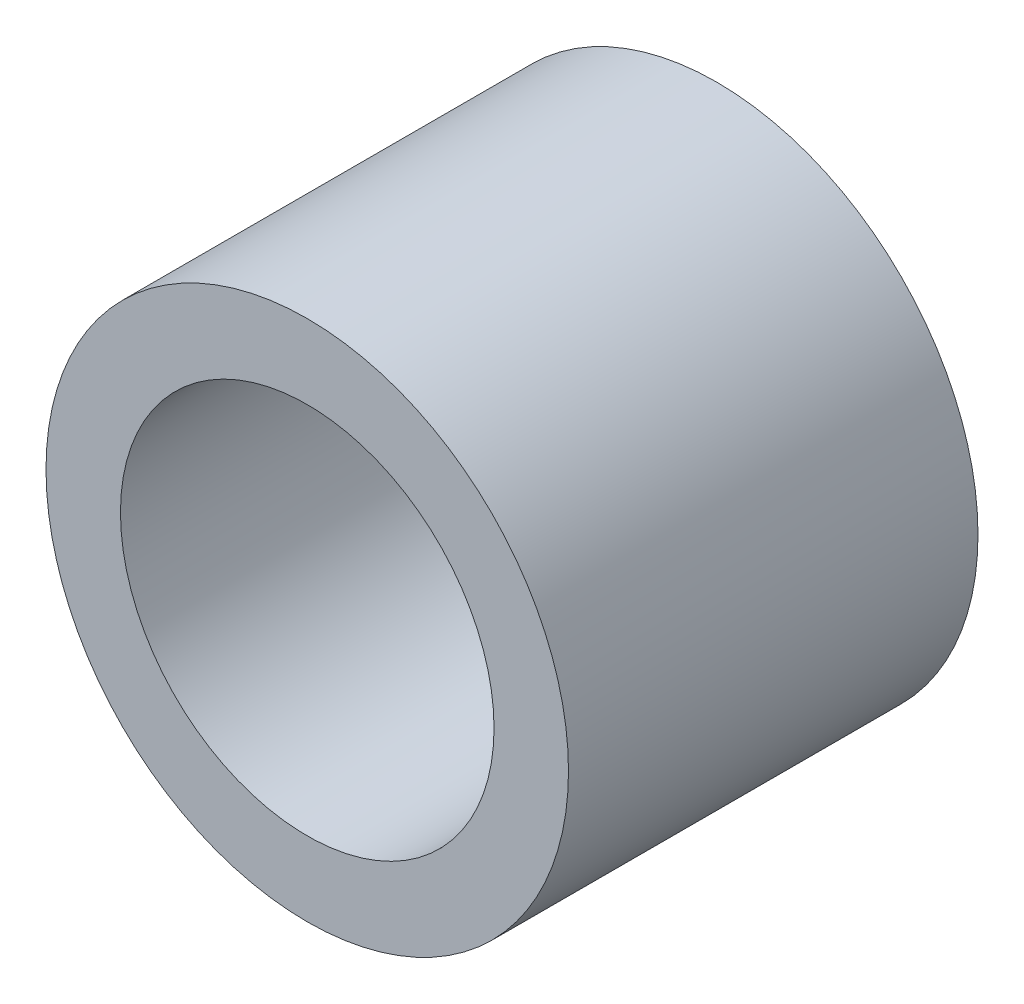
ISO-10303-21;
HEADER;
FILE_DESCRIPTION(('STEP AP214'),'2;1');
FILE_NAME('part.step','',(''),(''),'','','');
FILE_SCHEMA(('AUTOMOTIVE_DESIGN { 1 0 10303 214 1 1 1 1 }'));
ENDSEC;
DATA;
#1=APPLICATION_CONTEXT('core data for automotive mechanical design processes');
#2=APPLICATION_PROTOCOL_DEFINITION('international standard','automotive_design',2000,#1);
#3=PRODUCT_CONTEXT('',#1,'mechanical');
#4=PRODUCT('Part','Part','',(#3));
#5=PRODUCT_RELATED_PRODUCT_CATEGORY('part','',(#4));
#6=PRODUCT_DEFINITION_FORMATION('','',#4);
#7=PRODUCT_DEFINITION_CONTEXT('part definition',#1,'design');
#8=PRODUCT_DEFINITION('design','',#6,#7);
#9=PRODUCT_DEFINITION_SHAPE('','',#8);
#10=(LENGTH_UNIT() NAMED_UNIT(*) SI_UNIT(.MILLI.,.METRE.));
#11=(NAMED_UNIT(*) PLANE_ANGLE_UNIT() SI_UNIT($,.RADIAN.));
#12=(NAMED_UNIT(*) SI_UNIT($,.STERADIAN.) SOLID_ANGLE_UNIT());
#13=UNCERTAINTY_MEASURE_WITH_UNIT(LENGTH_MEASURE(1.E-05),#10,'distance_accuracy_value','');
#14=(GEOMETRIC_REPRESENTATION_CONTEXT(3) GLOBAL_UNCERTAINTY_ASSIGNED_CONTEXT((#13)) GLOBAL_UNIT_ASSIGNED_CONTEXT((#10,
#11,#12)) REPRESENTATION_CONTEXT('',''));
#15=CARTESIAN_POINT('',(0.,0.,0.));
#16=DIRECTION('',(0.,0.,1.));
#17=DIRECTION('',(1.,0.,0.));
#18=AXIS2_PLACEMENT_3D('',#15,#16,#17);
#19=CARTESIAN_POINT('',(0.,0.,33.));
#20=DIRECTION('',(0.,0.,1.));
#21=DIRECTION('',(1.,0.,0.));
#22=AXIS2_PLACEMENT_3D('',#19,#20,#21);
#23=PLANE('',#22);
#24=CARTESIAN_POINT('',(0.,0.,33.));
#25=DIRECTION('',(0.,0.,1.));
#26=DIRECTION('',(1.,0.,0.));
#27=AXIS2_PLACEMENT_3D('',#24,#25,#26);
#28=CIRCLE('',#27,21.053);
#29=CARTESIAN_POINT('',(21.053,0.,33.));
#30=VERTEX_POINT('',#29);
#31=EDGE_CURVE('E10',#30,#30,#28,.T.);
#32=ORIENTED_EDGE('',*,*,#31,.T.);
#33=EDGE_LOOP('',(#32));
#34=FACE_BOUND('',#33,.T.);
#35=CARTESIAN_POINT('',(0.,0.,33.));
#36=DIRECTION('',(0.,0.,1.));
#37=DIRECTION('',(1.,0.,0.));
#38=AXIS2_PLACEMENT_3D('',#35,#36,#37);
#39=CIRCLE('',#38,15.053);
#40=CARTESIAN_POINT('',(15.053,0.,33.));
#41=VERTEX_POINT('',#40);
#42=EDGE_CURVE('E45',#41,#41,#39,.T.);
#43=ORIENTED_EDGE('',*,*,#42,.F.);
#44=EDGE_LOOP('',(#43));
#45=FACE_BOUND('',#44,.T.);
#46=ADVANCED_FACE('F34',(#34,#45),#23,.T.);
#47=CARTESIAN_POINT('',(0.,0.,0.));
#48=DIRECTION('',(0.,0.,1.));
#49=DIRECTION('',(1.,0.,0.));
#50=AXIS2_PLACEMENT_3D('',#47,#48,#49);
#51=PLANE('',#50);
#52=CARTESIAN_POINT('',(0.,0.,0.));
#53=DIRECTION('',(0.,0.,1.));
#54=DIRECTION('',(1.,0.,0.));
#55=AXIS2_PLACEMENT_3D('',#52,#53,#54);
#56=CIRCLE('',#55,21.053);
#57=CARTESIAN_POINT('',(21.053,0.,0.));
#58=VERTEX_POINT('',#57);
#59=EDGE_CURVE('E38',#58,#58,#56,.T.);
#60=ORIENTED_EDGE('',*,*,#59,.F.);
#61=EDGE_LOOP('',(#60));
#62=FACE_BOUND('',#61,.T.);
#63=CARTESIAN_POINT('',(0.,0.,0.));
#64=DIRECTION('',(0.,0.,1.));
#65=DIRECTION('',(1.,0.,0.));
#66=AXIS2_PLACEMENT_3D('',#63,#64,#65);
#67=CIRCLE('',#66,15.053);
#68=CARTESIAN_POINT('',(15.053,0.,0.));
#69=VERTEX_POINT('',#68);
#70=EDGE_CURVE('E47',#69,#69,#67,.T.);
#71=ORIENTED_EDGE('',*,*,#70,.T.);
#72=EDGE_LOOP('',(#71));
#73=FACE_BOUND('',#72,.T.);
#74=ADVANCED_FACE('F57',(#62,#73),#51,.F.);
#75=CARTESIAN_POINT('',(0.,0.,33.));
#76=DIRECTION('',(0.,0.,-1.));
#77=DIRECTION('',(-1.,0.,0.));
#78=AXIS2_PLACEMENT_3D('',#75,#76,#77);
#79=CYLINDRICAL_SURFACE('',#78,21.053);
#80=ORIENTED_EDGE('',*,*,#31,.F.);
#81=EDGE_LOOP('',(#80));
#82=FACE_BOUND('',#81,.T.);
#83=ORIENTED_EDGE('',*,*,#59,.T.);
#84=EDGE_LOOP('',(#83));
#85=FACE_BOUND('',#84,.T.);
#86=ADVANCED_FACE('F36',(#82,#85),#79,.T.);
#87=CARTESIAN_POINT('',(0.,0.,33.));
#88=DIRECTION('',(0.,0.,-1.));
#89=DIRECTION('',(-1.,0.,0.));
#90=AXIS2_PLACEMENT_3D('',#87,#88,#89);
#91=CYLINDRICAL_SURFACE('',#90,15.053);
#92=ORIENTED_EDGE('',*,*,#42,.T.);
#93=EDGE_LOOP('',(#92));
#94=FACE_BOUND('',#93,.T.);
#95=ORIENTED_EDGE('',*,*,#70,.F.);
#96=EDGE_LOOP('',(#95));
#97=FACE_BOUND('',#96,.T.);
#98=ADVANCED_FACE('F53',(#94,#97),#91,.F.);
#99=CLOSED_SHELL('',(#46,#74,#86,#98));
#100=MANIFOLD_SOLID_BREP('B2',#99);
#101=ADVANCED_BREP_SHAPE_REPRESENTATION('',(#18,#100),#14);
#102=SHAPE_DEFINITION_REPRESENTATION(#9,#101);
ENDSEC;
END-ISO-10303-21;
